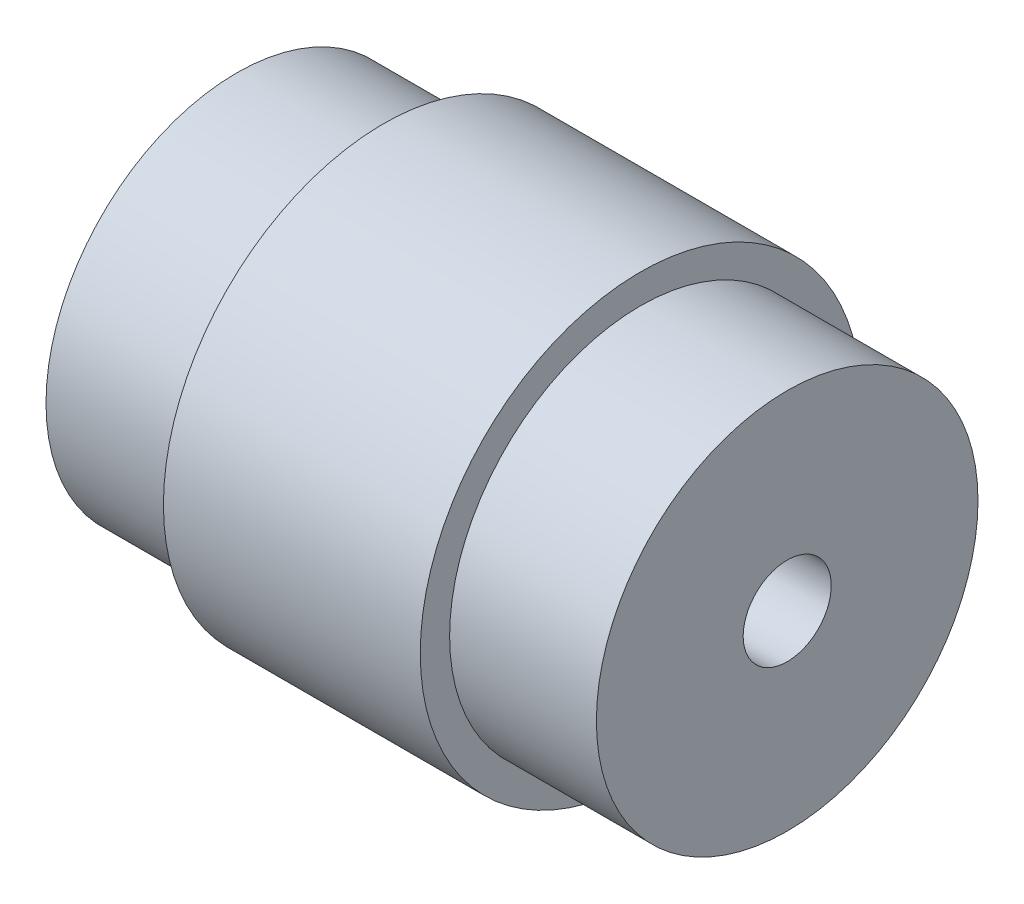
ISO-10303-21;
HEADER;
FILE_DESCRIPTION(('STEP AP214'),'2;1');
FILE_NAME('part.step','',(''),(''),'','','');
FILE_SCHEMA(('AUTOMOTIVE_DESIGN { 1 0 10303 214 1 1 1 1 }'));
ENDSEC;
DATA;
#1=APPLICATION_CONTEXT('core data for automotive mechanical design processes');
#2=APPLICATION_PROTOCOL_DEFINITION('international standard','automotive_design',2000,#1);
#3=PRODUCT_CONTEXT('',#1,'mechanical');
#4=PRODUCT('Part','Part','',(#3));
#5=PRODUCT_RELATED_PRODUCT_CATEGORY('part','',(#4));
#6=PRODUCT_DEFINITION_FORMATION('','',#4);
#7=PRODUCT_DEFINITION_CONTEXT('part definition',#1,'design');
#8=PRODUCT_DEFINITION('design','',#6,#7);
#9=PRODUCT_DEFINITION_SHAPE('','',#8);
#10=(LENGTH_UNIT() NAMED_UNIT(*) SI_UNIT(.MILLI.,.METRE.));
#11=(NAMED_UNIT(*) PLANE_ANGLE_UNIT() SI_UNIT($,.RADIAN.));
#12=(NAMED_UNIT(*) SI_UNIT($,.STERADIAN.) SOLID_ANGLE_UNIT());
#13=UNCERTAINTY_MEASURE_WITH_UNIT(LENGTH_MEASURE(1.E-05),#10,'distance_accuracy_value','');
#14=(GEOMETRIC_REPRESENTATION_CONTEXT(3) GLOBAL_UNCERTAINTY_ASSIGNED_CONTEXT((#13)) GLOBAL_UNIT_ASSIGNED_CONTEXT((#10,
#11,#12)) REPRESENTATION_CONTEXT('',''));
#15=CARTESIAN_POINT('',(0.,0.,0.));
#16=DIRECTION('',(0.,0.,1.));
#17=DIRECTION('',(1.,0.,0.));
#18=AXIS2_PLACEMENT_3D('',#15,#16,#17);
#19=CARTESIAN_POINT('',(0.,0.,0.));
#20=DIRECTION('',(-1.,0.,0.));
#21=DIRECTION('',(0.,0.,1.));
#22=AXIS2_PLACEMENT_3D('',#19,#20,#21);
#23=CYLINDRICAL_SURFACE('',#22,13.);
#24=CARTESIAN_POINT('',(0.,0.,0.));
#25=DIRECTION('',(-1.,0.,0.));
#26=DIRECTION('',(0.,0.,1.));
#27=AXIS2_PLACEMENT_3D('',#24,#25,#26);
#28=CIRCLE('',#27,13.);
#29=CARTESIAN_POINT('',(0.,0.,13.));
#30=VERTEX_POINT('',#29);
#31=EDGE_CURVE('E10',#30,#30,#28,.T.);
#32=ORIENTED_EDGE('',*,*,#31,.F.);
#33=EDGE_LOOP('',(#32));
#34=FACE_BOUND('',#33,.T.);
#35=CARTESIAN_POINT('',(10.,0.,0.));
#36=DIRECTION('',(-1.,0.,0.));
#37=DIRECTION('',(0.,0.,1.));
#38=AXIS2_PLACEMENT_3D('',#35,#36,#37);
#39=CIRCLE('',#38,13.);
#40=CARTESIAN_POINT('',(10.,0.,13.));
#41=VERTEX_POINT('',#40);
#42=EDGE_CURVE('E78',#41,#41,#39,.T.);
#43=ORIENTED_EDGE('',*,*,#42,.T.);
#44=EDGE_LOOP('',(#43));
#45=FACE_BOUND('',#44,.T.);
#46=ADVANCED_FACE('F43',(#34,#45),#23,.T.);
#47=CARTESIAN_POINT('',(0.,3.,0.));
#48=DIRECTION('',(1.,0.,0.));
#49=DIRECTION('',(0.,0.,-1.));
#50=AXIS2_PLACEMENT_3D('',#47,#48,#49);
#51=PLANE('',#50);
#52=CARTESIAN_POINT('',(0.,0.,0.));
#53=DIRECTION('',(-1.,0.,0.));
#54=DIRECTION('',(0.,0.,1.));
#55=AXIS2_PLACEMENT_3D('',#52,#53,#54);
#56=CIRCLE('',#55,3.);
#57=CARTESIAN_POINT('',(0.,0.,3.));
#58=VERTEX_POINT('',#57);
#59=EDGE_CURVE('E50',#58,#58,#56,.T.);
#60=ORIENTED_EDGE('',*,*,#59,.F.);
#61=EDGE_LOOP('',(#60));
#62=FACE_BOUND('',#61,.T.);
#63=ORIENTED_EDGE('',*,*,#31,.T.);
#64=EDGE_LOOP('',(#63));
#65=FACE_BOUND('',#64,.T.);
#66=ADVANCED_FACE('F116',(#62,#65),#51,.F.);
#67=CARTESIAN_POINT('',(0.,0.,0.));
#68=DIRECTION('',(-1.,0.,0.));
#69=DIRECTION('',(0.,0.,1.));
#70=AXIS2_PLACEMENT_3D('',#67,#68,#69);
#71=CYLINDRICAL_SURFACE('',#70,3.);
#72=CARTESIAN_POINT('',(37.5,0.,0.));
#73=DIRECTION('',(-1.,0.,0.));
#74=DIRECTION('',(0.,0.,1.));
#75=AXIS2_PLACEMENT_3D('',#72,#73,#74);
#76=CIRCLE('',#75,3.);
#77=CARTESIAN_POINT('',(37.5,0.,3.));
#78=VERTEX_POINT('',#77);
#79=EDGE_CURVE('E55',#78,#78,#76,.T.);
#80=ORIENTED_EDGE('',*,*,#79,.F.);
#81=EDGE_LOOP('',(#80));
#82=FACE_BOUND('',#81,.T.);
#83=ORIENTED_EDGE('',*,*,#59,.T.);
#84=EDGE_LOOP('',(#83));
#85=FACE_BOUND('',#84,.T.);
#86=ADVANCED_FACE('F111',(#82,#85),#71,.F.);
#87=CARTESIAN_POINT('',(37.5,13.,0.));
#88=DIRECTION('',(-1.,0.,0.));
#89=DIRECTION('',(0.,0.,1.));
#90=AXIS2_PLACEMENT_3D('',#87,#88,#89);
#91=PLANE('',#90);
#92=CARTESIAN_POINT('',(37.5,0.,0.));
#93=DIRECTION('',(-1.,0.,0.));
#94=DIRECTION('',(0.,0.,1.));
#95=AXIS2_PLACEMENT_3D('',#92,#93,#94);
#96=CIRCLE('',#95,13.);
#97=CARTESIAN_POINT('',(37.5,0.,13.));
#98=VERTEX_POINT('',#97);
#99=EDGE_CURVE('E60',#98,#98,#96,.T.);
#100=ORIENTED_EDGE('',*,*,#99,.F.);
#101=EDGE_LOOP('',(#100));
#102=FACE_BOUND('',#101,.T.);
#103=ORIENTED_EDGE('',*,*,#79,.T.);
#104=EDGE_LOOP('',(#103));
#105=FACE_BOUND('',#104,.T.);
#106=ADVANCED_FACE('F105',(#102,#105),#91,.F.);
#107=CARTESIAN_POINT('',(0.,0.,0.));
#108=DIRECTION('',(-1.,0.,0.));
#109=DIRECTION('',(0.,0.,1.));
#110=AXIS2_PLACEMENT_3D('',#107,#108,#109);
#111=CYLINDRICAL_SURFACE('',#110,13.);
#112=CARTESIAN_POINT('',(27.5,0.,0.));
#113=DIRECTION('',(-1.,0.,0.));
#114=DIRECTION('',(0.,0.,1.));
#115=AXIS2_PLACEMENT_3D('',#112,#113,#114);
#116=CIRCLE('',#115,13.);
#117=CARTESIAN_POINT('',(27.5,0.,13.));
#118=VERTEX_POINT('',#117);
#119=EDGE_CURVE('E66',#118,#118,#116,.T.);
#120=ORIENTED_EDGE('',*,*,#119,.F.);
#121=EDGE_LOOP('',(#120));
#122=FACE_BOUND('',#121,.T.);
#123=ORIENTED_EDGE('',*,*,#99,.T.);
#124=EDGE_LOOP('',(#123));
#125=FACE_BOUND('',#124,.T.);
#126=ADVANCED_FACE('F99',(#122,#125),#111,.T.);
#127=CARTESIAN_POINT('',(27.5,15.,0.));
#128=DIRECTION('',(-1.,0.,0.));
#129=DIRECTION('',(0.,0.,1.));
#130=AXIS2_PLACEMENT_3D('',#127,#128,#129);
#131=PLANE('',#130);
#132=CARTESIAN_POINT('',(27.5,0.,0.));
#133=DIRECTION('',(-1.,0.,0.));
#134=DIRECTION('',(0.,0.,1.));
#135=AXIS2_PLACEMENT_3D('',#132,#133,#134);
#136=CIRCLE('',#135,15.);
#137=CARTESIAN_POINT('',(27.5,0.,15.));
#138=VERTEX_POINT('',#137);
#139=EDGE_CURVE('E70',#138,#138,#136,.T.);
#140=ORIENTED_EDGE('',*,*,#139,.F.);
#141=EDGE_LOOP('',(#140));
#142=FACE_BOUND('',#141,.T.);
#143=ORIENTED_EDGE('',*,*,#119,.T.);
#144=EDGE_LOOP('',(#143));
#145=FACE_BOUND('',#144,.T.);
#146=ADVANCED_FACE('F93',(#142,#145),#131,.F.);
#147=CARTESIAN_POINT('',(0.,0.,0.));
#148=DIRECTION('',(-1.,0.,0.));
#149=DIRECTION('',(0.,0.,1.));
#150=AXIS2_PLACEMENT_3D('',#147,#148,#149);
#151=CYLINDRICAL_SURFACE('',#150,15.);
#152=CARTESIAN_POINT('',(10.,0.,0.));
#153=DIRECTION('',(-1.,0.,0.));
#154=DIRECTION('',(0.,0.,1.));
#155=AXIS2_PLACEMENT_3D('',#152,#153,#154);
#156=CIRCLE('',#155,15.);
#157=CARTESIAN_POINT('',(10.,0.,15.));
#158=VERTEX_POINT('',#157);
#159=EDGE_CURVE('E74',#158,#158,#156,.T.);
#160=ORIENTED_EDGE('',*,*,#159,.F.);
#161=EDGE_LOOP('',(#160));
#162=FACE_BOUND('',#161,.T.);
#163=ORIENTED_EDGE('',*,*,#139,.T.);
#164=EDGE_LOOP('',(#163));
#165=FACE_BOUND('',#164,.T.);
#166=ADVANCED_FACE('F87',(#162,#165),#151,.T.);
#167=CARTESIAN_POINT('',(10.,13.,0.));
#168=DIRECTION('',(1.,0.,0.));
#169=DIRECTION('',(0.,0.,-1.));
#170=AXIS2_PLACEMENT_3D('',#167,#168,#169);
#171=PLANE('',#170);
#172=ORIENTED_EDGE('',*,*,#42,.F.);
#173=EDGE_LOOP('',(#172));
#174=FACE_BOUND('',#173,.T.);
#175=ORIENTED_EDGE('',*,*,#159,.T.);
#176=EDGE_LOOP('',(#175));
#177=FACE_BOUND('',#176,.T.);
#178=ADVANCED_FACE('F84',(#174,#177),#171,.F.);
#179=CLOSED_SHELL('',(#46,#66,#86,#106,#126,#146,#166,#178));
#180=MANIFOLD_SOLID_BREP('B2',#179);
#181=ADVANCED_BREP_SHAPE_REPRESENTATION('',(#18,#180),#14);
#182=SHAPE_DEFINITION_REPRESENTATION(#9,#181);
ENDSEC;
END-ISO-10303-21;
